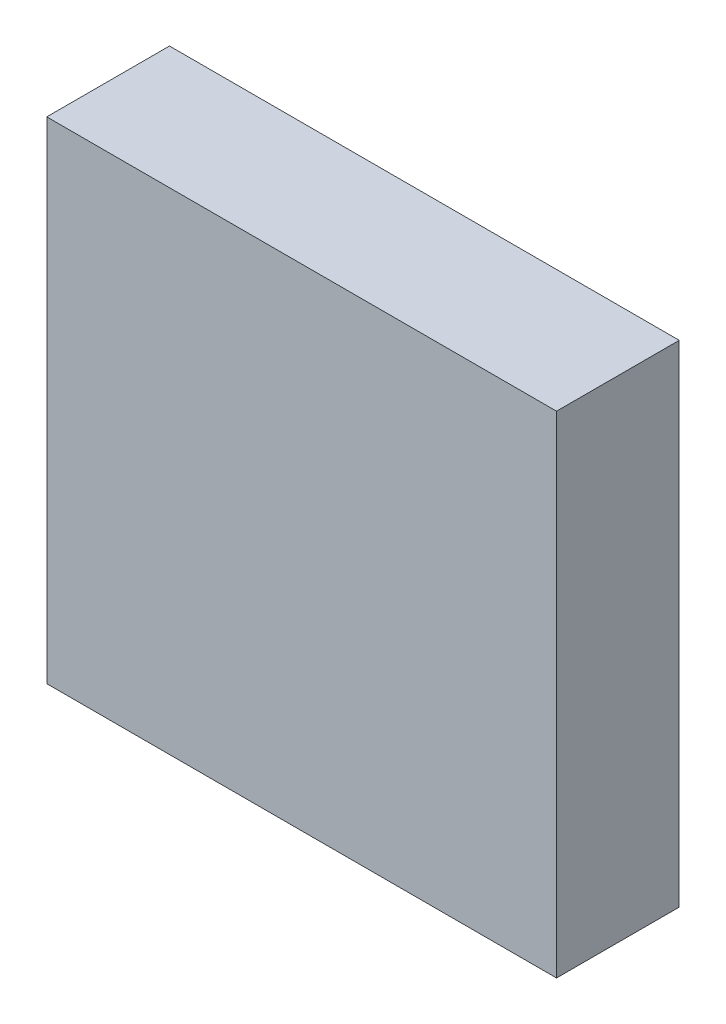
ISO-10303-21;
HEADER;
FILE_DESCRIPTION(('STEP AP214'),'2;1');
FILE_NAME('part.step','',(''),(''),'','','');
FILE_SCHEMA(('AUTOMOTIVE_DESIGN { 1 0 10303 214 1 1 1 1 }'));
ENDSEC;
DATA;
#1=APPLICATION_CONTEXT('core data for automotive mechanical design processes');
#2=APPLICATION_PROTOCOL_DEFINITION('international standard','automotive_design',2000,#1);
#3=PRODUCT_CONTEXT('',#1,'mechanical');
#4=PRODUCT('Part','Part','',(#3));
#5=PRODUCT_RELATED_PRODUCT_CATEGORY('part','',(#4));
#6=PRODUCT_DEFINITION_FORMATION('','',#4);
#7=PRODUCT_DEFINITION_CONTEXT('part definition',#1,'design');
#8=PRODUCT_DEFINITION('design','',#6,#7);
#9=PRODUCT_DEFINITION_SHAPE('','',#8);
#10=(LENGTH_UNIT() NAMED_UNIT(*) SI_UNIT(.MILLI.,.METRE.));
#11=(NAMED_UNIT(*) PLANE_ANGLE_UNIT() SI_UNIT($,.RADIAN.));
#12=(NAMED_UNIT(*) SI_UNIT($,.STERADIAN.) SOLID_ANGLE_UNIT());
#13=UNCERTAINTY_MEASURE_WITH_UNIT(LENGTH_MEASURE(1.E-05),#10,'distance_accuracy_value','');
#14=(GEOMETRIC_REPRESENTATION_CONTEXT(3) GLOBAL_UNCERTAINTY_ASSIGNED_CONTEXT((#13)) GLOBAL_UNIT_ASSIGNED_CONTEXT((#10,
#11,#12)) REPRESENTATION_CONTEXT('',''));
#15=CARTESIAN_POINT('',(0.,0.,0.));
#16=DIRECTION('',(0.,0.,1.));
#17=DIRECTION('',(1.,0.,0.));
#18=AXIS2_PLACEMENT_3D('',#15,#16,#17);
#19=CARTESIAN_POINT('',(13.5,13.,3.25));
#20=DIRECTION('',(-1.,0.,0.));
#21=DIRECTION('',(0.,-1.,0.));
#22=AXIS2_PLACEMENT_3D('',#19,#20,#21);
#23=PLANE('',#22);
#24=DIRECTION('',(0.,1.,0.));
#25=VECTOR('',#24,1.);
#26=CARTESIAN_POINT('',(13.5,13.,-3.25));
#27=LINE('',#26,#25);
#28=CARTESIAN_POINT('',(13.5,-13.,-3.25));
#29=VERTEX_POINT('',#28);
#30=CARTESIAN_POINT('',(13.5,13.,-3.25));
#31=VERTEX_POINT('',#30);
#32=EDGE_CURVE('E99',#29,#31,#27,.T.);
#33=ORIENTED_EDGE('',*,*,#32,.T.);
#34=DIRECTION('',(0.,0.,-1.));
#35=VECTOR('',#34,1.);
#36=CARTESIAN_POINT('',(13.5,13.,3.25));
#37=LINE('',#36,#35);
#38=CARTESIAN_POINT('',(13.5,13.,3.25));
#39=VERTEX_POINT('',#38);
#40=EDGE_CURVE('E11',#39,#31,#37,.T.);
#41=ORIENTED_EDGE('',*,*,#40,.F.);
#42=DIRECTION('',(0.,1.,0.));
#43=VECTOR('',#42,1.);
#44=CARTESIAN_POINT('',(13.5,13.,3.25));
#45=LINE('',#44,#43);
#46=CARTESIAN_POINT('',(13.5,-13.,3.25));
#47=VERTEX_POINT('',#46);
#48=EDGE_CURVE('E87',#47,#39,#45,.T.);
#49=ORIENTED_EDGE('',*,*,#48,.F.);
#50=DIRECTION('',(0.,0.,-1.));
#51=VECTOR('',#50,1.);
#52=CARTESIAN_POINT('',(13.5,-13.,3.25));
#53=LINE('',#52,#51);
#54=EDGE_CURVE('E95',#47,#29,#53,.T.);
#55=ORIENTED_EDGE('',*,*,#54,.T.);
#56=EDGE_LOOP('',(#33,#41,#49,#55));
#57=FACE_BOUND('',#56,.T.);
#58=ADVANCED_FACE('F36',(#57),#23,.F.);
#59=CARTESIAN_POINT('',(-13.5,13.,3.25));
#60=DIRECTION('',(0.,-1.,0.));
#61=DIRECTION('',(0.,0.,-1.));
#62=AXIS2_PLACEMENT_3D('',#59,#60,#61);
#63=PLANE('',#62);
#64=DIRECTION('',(-1.,0.,0.));
#65=VECTOR('',#64,1.);
#66=CARTESIAN_POINT('',(-13.5,13.,-3.25));
#67=LINE('',#66,#65);
#68=CARTESIAN_POINT('',(-13.5,13.,-3.25));
#69=VERTEX_POINT('',#68);
#70=EDGE_CURVE('E91',#31,#69,#67,.T.);
#71=ORIENTED_EDGE('',*,*,#70,.T.);
#72=DIRECTION('',(0.,0.,-1.));
#73=VECTOR('',#72,1.);
#74=CARTESIAN_POINT('',(-13.5,13.,3.25));
#75=LINE('',#74,#73);
#76=CARTESIAN_POINT('',(-13.5,13.,3.25));
#77=VERTEX_POINT('',#76);
#78=EDGE_CURVE('E44',#77,#69,#75,.T.);
#79=ORIENTED_EDGE('',*,*,#78,.F.);
#80=DIRECTION('',(-1.,0.,0.));
#81=VECTOR('',#80,1.);
#82=CARTESIAN_POINT('',(-13.5,13.,3.25));
#83=LINE('',#82,#81);
#84=EDGE_CURVE('E82',#39,#77,#83,.T.);
#85=ORIENTED_EDGE('',*,*,#84,.F.);
#86=ORIENTED_EDGE('',*,*,#40,.T.);
#87=EDGE_LOOP('',(#71,#79,#85,#86));
#88=FACE_BOUND('',#87,.T.);
#89=ADVANCED_FACE('F90',(#88),#63,.F.);
#90=CARTESIAN_POINT('',(-13.5,13.,3.25));
#91=DIRECTION('',(1.,0.,0.));
#92=DIRECTION('',(0.,1.,0.));
#93=AXIS2_PLACEMENT_3D('',#90,#91,#92);
#94=PLANE('',#93);
#95=DIRECTION('',(0.,-1.,0.));
#96=VECTOR('',#95,1.);
#97=CARTESIAN_POINT('',(-13.5,13.,-3.25));
#98=LINE('',#97,#96);
#99=CARTESIAN_POINT('',(-13.5,-13.,-3.25));
#100=VERTEX_POINT('',#99);
#101=EDGE_CURVE('E69',#69,#100,#98,.T.);
#102=ORIENTED_EDGE('',*,*,#101,.T.);
#103=DIRECTION('',(0.,0.,-1.));
#104=VECTOR('',#103,1.);
#105=CARTESIAN_POINT('',(-13.5,-13.,3.25));
#106=LINE('',#105,#104);
#107=CARTESIAN_POINT('',(-13.5,-13.,3.25));
#108=VERTEX_POINT('',#107);
#109=EDGE_CURVE('E92',#108,#100,#106,.T.);
#110=ORIENTED_EDGE('',*,*,#109,.F.);
#111=DIRECTION('',(0.,-1.,0.));
#112=VECTOR('',#111,1.);
#113=CARTESIAN_POINT('',(-13.5,13.,3.25));
#114=LINE('',#113,#112);
#115=EDGE_CURVE('E85',#77,#108,#114,.T.);
#116=ORIENTED_EDGE('',*,*,#115,.F.);
#117=ORIENTED_EDGE('',*,*,#78,.T.);
#118=EDGE_LOOP('',(#102,#110,#116,#117));
#119=FACE_BOUND('',#118,.T.);
#120=ADVANCED_FACE('F93',(#119),#94,.F.);
#121=CARTESIAN_POINT('',(-13.5,-13.,3.25));
#122=DIRECTION('',(0.,1.,0.));
#123=DIRECTION('',(0.,0.,1.));
#124=AXIS2_PLACEMENT_3D('',#121,#122,#123);
#125=PLANE('',#124);
#126=DIRECTION('',(1.,0.,0.));
#127=VECTOR('',#126,1.);
#128=CARTESIAN_POINT('',(-13.5,-13.,-3.25));
#129=LINE('',#128,#127);
#130=EDGE_CURVE('E75',#100,#29,#129,.T.);
#131=ORIENTED_EDGE('',*,*,#130,.T.);
#132=ORIENTED_EDGE('',*,*,#54,.F.);
#133=DIRECTION('',(1.,0.,0.));
#134=VECTOR('',#133,1.);
#135=CARTESIAN_POINT('',(-13.5,-13.,3.25));
#136=LINE('',#135,#134);
#137=EDGE_CURVE('E52',#108,#47,#136,.T.);
#138=ORIENTED_EDGE('',*,*,#137,.F.);
#139=ORIENTED_EDGE('',*,*,#109,.T.);
#140=EDGE_LOOP('',(#131,#132,#138,#139));
#141=FACE_BOUND('',#140,.T.);
#142=ADVANCED_FACE('F106',(#141),#125,.F.);
#143=CARTESIAN_POINT('',(0.,0.,3.25));
#144=DIRECTION('',(0.,0.,1.));
#145=DIRECTION('',(1.,0.,0.));
#146=AXIS2_PLACEMENT_3D('',#143,#144,#145);
#147=PLANE('',#146);
#148=ORIENTED_EDGE('',*,*,#48,.T.);
#149=ORIENTED_EDGE('',*,*,#84,.T.);
#150=ORIENTED_EDGE('',*,*,#115,.T.);
#151=ORIENTED_EDGE('',*,*,#137,.T.);
#152=EDGE_LOOP('',(#148,#149,#150,#151));
#153=FACE_BOUND('',#152,.T.);
#154=ADVANCED_FACE('F83',(#153),#147,.T.);
#155=CARTESIAN_POINT('',(0.,0.,-3.25));
#156=DIRECTION('',(0.,0.,1.));
#157=DIRECTION('',(1.,0.,0.));
#158=AXIS2_PLACEMENT_3D('',#155,#156,#157);
#159=PLANE('',#158);
#160=ORIENTED_EDGE('',*,*,#32,.F.);
#161=ORIENTED_EDGE('',*,*,#130,.F.);
#162=ORIENTED_EDGE('',*,*,#101,.F.);
#163=ORIENTED_EDGE('',*,*,#70,.F.);
#164=EDGE_LOOP('',(#160,#161,#162,#163));
#165=FACE_BOUND('',#164,.T.);
#166=ADVANCED_FACE('F109',(#165),#159,.F.);
#167=CLOSED_SHELL('',(#58,#89,#120,#142,#154,#166));
#168=MANIFOLD_SOLID_BREP('B2',#167);
#169=ADVANCED_BREP_SHAPE_REPRESENTATION('',(#18,#168),#14);
#170=SHAPE_DEFINITION_REPRESENTATION(#9,#169);
ENDSEC;
END-ISO-10303-21;
